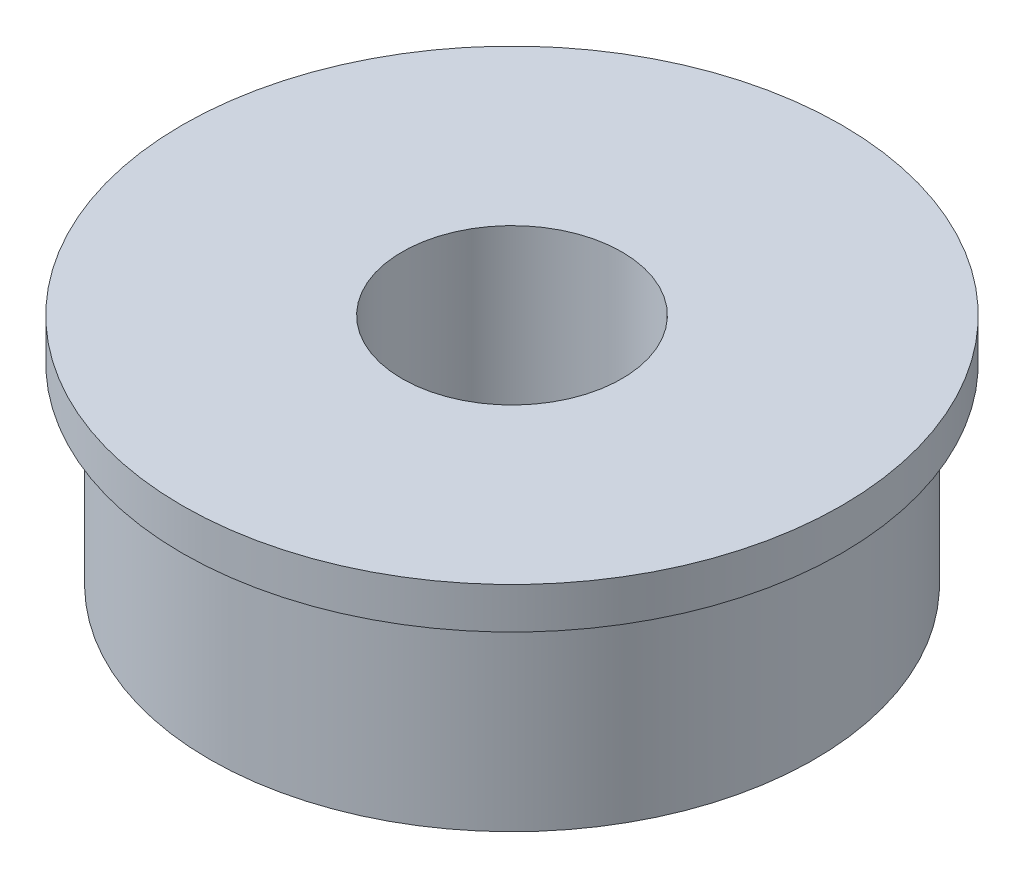
ISO-10303-21;
HEADER;
FILE_DESCRIPTION(('STEP AP214'),'2;1');
FILE_NAME('part.step','',(''),(''),'','','');
FILE_SCHEMA(('AUTOMOTIVE_DESIGN { 1 0 10303 214 1 1 1 1 }'));
ENDSEC;
DATA;
#1=APPLICATION_CONTEXT('core data for automotive mechanical design processes');
#2=APPLICATION_PROTOCOL_DEFINITION('international standard','automotive_design',2000,#1);
#3=PRODUCT_CONTEXT('',#1,'mechanical');
#4=PRODUCT('Part','Part','',(#3));
#5=PRODUCT_RELATED_PRODUCT_CATEGORY('part','',(#4));
#6=PRODUCT_DEFINITION_FORMATION('','',#4);
#7=PRODUCT_DEFINITION_CONTEXT('part definition',#1,'design');
#8=PRODUCT_DEFINITION('design','',#6,#7);
#9=PRODUCT_DEFINITION_SHAPE('','',#8);
#10=(LENGTH_UNIT() NAMED_UNIT(*) SI_UNIT(.MILLI.,.METRE.));
#11=(NAMED_UNIT(*) PLANE_ANGLE_UNIT() SI_UNIT($,.RADIAN.));
#12=(NAMED_UNIT(*) SI_UNIT($,.STERADIAN.) SOLID_ANGLE_UNIT());
#13=UNCERTAINTY_MEASURE_WITH_UNIT(LENGTH_MEASURE(1.E-05),#10,'distance_accuracy_value','');
#14=(GEOMETRIC_REPRESENTATION_CONTEXT(3) GLOBAL_UNCERTAINTY_ASSIGNED_CONTEXT((#13)) GLOBAL_UNIT_ASSIGNED_CONTEXT((#10,
#11,#12)) REPRESENTATION_CONTEXT('',''));
#15=CARTESIAN_POINT('',(0.,0.,0.));
#16=DIRECTION('',(0.,0.,1.));
#17=DIRECTION('',(1.,0.,0.));
#18=AXIS2_PLACEMENT_3D('',#15,#16,#17);
#19=CARTESIAN_POINT('',(0.,0.,0.));
#20=DIRECTION('',(0.,1.,0.));
#21=DIRECTION('',(0.,0.,1.));
#22=AXIS2_PLACEMENT_3D('',#19,#20,#21);
#23=PLANE('',#22);
#24=CARTESIAN_POINT('',(0.,0.,0.));
#25=DIRECTION('',(0.,1.,0.));
#26=DIRECTION('',(0.,0.,1.));
#27=AXIS2_PLACEMENT_3D('',#24,#25,#26);
#28=CIRCLE('',#27,11.);
#29=CARTESIAN_POINT('',(0.,0.,11.));
#30=VERTEX_POINT('',#29);
#31=EDGE_CURVE('E37',#30,#30,#28,.T.);
#32=ORIENTED_EDGE('',*,*,#31,.F.);
#33=EDGE_LOOP('',(#32));
#34=FACE_BOUND('',#33,.T.);
#35=CARTESIAN_POINT('',(0.,0.,0.));
#36=DIRECTION('',(0.,1.,0.));
#37=DIRECTION('',(0.,0.,1.));
#38=AXIS2_PLACEMENT_3D('',#35,#36,#37);
#39=CIRCLE('',#38,4.);
#40=CARTESIAN_POINT('',(0.,0.,4.));
#41=VERTEX_POINT('',#40);
#42=EDGE_CURVE('E44',#41,#41,#39,.T.);
#43=ORIENTED_EDGE('',*,*,#42,.T.);
#44=EDGE_LOOP('',(#43));
#45=FACE_BOUND('',#44,.T.);
#46=ADVANCED_FACE('F33',(#34,#45),#23,.F.);
#47=CARTESIAN_POINT('',(0.,7.,0.));
#48=DIRECTION('',(0.,-1.,0.));
#49=DIRECTION('',(0.,0.,-1.));
#50=AXIS2_PLACEMENT_3D('',#47,#48,#49);
#51=CYLINDRICAL_SURFACE('',#50,11.);
#52=CARTESIAN_POINT('',(0.,7.,0.));
#53=DIRECTION('',(0.,1.,0.));
#54=DIRECTION('',(0.,0.,1.));
#55=AXIS2_PLACEMENT_3D('',#52,#53,#54);
#56=CIRCLE('',#55,11.);
#57=CARTESIAN_POINT('',(0.,7.,11.));
#58=VERTEX_POINT('',#57);
#59=EDGE_CURVE('E10',#58,#58,#56,.T.);
#60=ORIENTED_EDGE('',*,*,#59,.F.);
#61=EDGE_LOOP('',(#60));
#62=FACE_BOUND('',#61,.T.);
#63=ORIENTED_EDGE('',*,*,#31,.T.);
#64=EDGE_LOOP('',(#63));
#65=FACE_BOUND('',#64,.T.);
#66=ADVANCED_FACE('F35',(#62,#65),#51,.T.);
#67=CARTESIAN_POINT('',(0.,7.,0.));
#68=DIRECTION('',(0.,-1.,0.));
#69=DIRECTION('',(0.,0.,-1.));
#70=AXIS2_PLACEMENT_3D('',#67,#68,#69);
#71=CYLINDRICAL_SURFACE('',#70,4.);
#72=ORIENTED_EDGE('',*,*,#42,.F.);
#73=EDGE_LOOP('',(#72));
#74=FACE_BOUND('',#73,.T.);
#75=CARTESIAN_POINT('',(0.,8.5,0.));
#76=DIRECTION('',(0.,1.,0.));
#77=DIRECTION('',(0.,0.,1.));
#78=AXIS2_PLACEMENT_3D('',#75,#76,#77);
#79=CIRCLE('',#78,4.);
#80=CARTESIAN_POINT('',(0.,8.5,4.));
#81=VERTEX_POINT('',#80);
#82=EDGE_CURVE('E52',#81,#81,#79,.T.);
#83=ORIENTED_EDGE('',*,*,#82,.T.);
#84=EDGE_LOOP('',(#83));
#85=FACE_BOUND('',#84,.T.);
#86=ADVANCED_FACE('F58',(#74,#85),#71,.F.);
#87=CARTESIAN_POINT('',(0.,8.5,0.));
#88=DIRECTION('',(0.,1.,0.));
#89=DIRECTION('',(0.,0.,1.));
#90=AXIS2_PLACEMENT_3D('',#87,#88,#89);
#91=PLANE('',#90);
#92=CARTESIAN_POINT('',(0.,8.5,0.));
#93=DIRECTION('',(0.,1.,0.));
#94=DIRECTION('',(0.,0.,1.));
#95=AXIS2_PLACEMENT_3D('',#92,#93,#94);
#96=CIRCLE('',#95,12.);
#97=CARTESIAN_POINT('',(0.,8.5,12.));
#98=VERTEX_POINT('',#97);
#99=EDGE_CURVE('E48',#98,#98,#96,.T.);
#100=ORIENTED_EDGE('',*,*,#99,.T.);
#101=EDGE_LOOP('',(#100));
#102=FACE_BOUND('',#101,.T.);
#103=ORIENTED_EDGE('',*,*,#82,.F.);
#104=EDGE_LOOP('',(#103));
#105=FACE_BOUND('',#104,.T.);
#106=ADVANCED_FACE('F60',(#102,#105),#91,.T.);
#107=CARTESIAN_POINT('',(0.,7.,0.));
#108=DIRECTION('',(0.,1.,0.));
#109=DIRECTION('',(0.,0.,1.));
#110=AXIS2_PLACEMENT_3D('',#107,#108,#109);
#111=PLANE('',#110);
#112=ORIENTED_EDGE('',*,*,#59,.T.);
#113=EDGE_LOOP('',(#112));
#114=FACE_BOUND('',#113,.T.);
#115=CARTESIAN_POINT('',(0.,7.,0.));
#116=DIRECTION('',(0.,1.,0.));
#117=DIRECTION('',(0.,0.,1.));
#118=AXIS2_PLACEMENT_3D('',#115,#116,#117);
#119=CIRCLE('',#118,12.);
#120=CARTESIAN_POINT('',(0.,7.,12.));
#121=VERTEX_POINT('',#120);
#122=EDGE_CURVE('E49',#121,#121,#119,.T.);
#123=ORIENTED_EDGE('',*,*,#122,.F.);
#124=EDGE_LOOP('',(#123));
#125=FACE_BOUND('',#124,.T.);
#126=ADVANCED_FACE('F62',(#114,#125),#111,.F.);
#127=CARTESIAN_POINT('',(0.,8.5,0.));
#128=DIRECTION('',(0.,-1.,0.));
#129=DIRECTION('',(0.,0.,-1.));
#130=AXIS2_PLACEMENT_3D('',#127,#128,#129);
#131=CYLINDRICAL_SURFACE('',#130,12.);
#132=ORIENTED_EDGE('',*,*,#99,.F.);
#133=EDGE_LOOP('',(#132));
#134=FACE_BOUND('',#133,.T.);
#135=ORIENTED_EDGE('',*,*,#122,.T.);
#136=EDGE_LOOP('',(#135));
#137=FACE_BOUND('',#136,.T.);
#138=ADVANCED_FACE('F69',(#134,#137),#131,.T.);
#139=CLOSED_SHELL('',(#46,#66,#86,#106,#126,#138));
#140=MANIFOLD_SOLID_BREP('B2',#139);
#141=ADVANCED_BREP_SHAPE_REPRESENTATION('',(#18,#140),#14);
#142=SHAPE_DEFINITION_REPRESENTATION(#9,#141);
ENDSEC;
END-ISO-10303-21;
